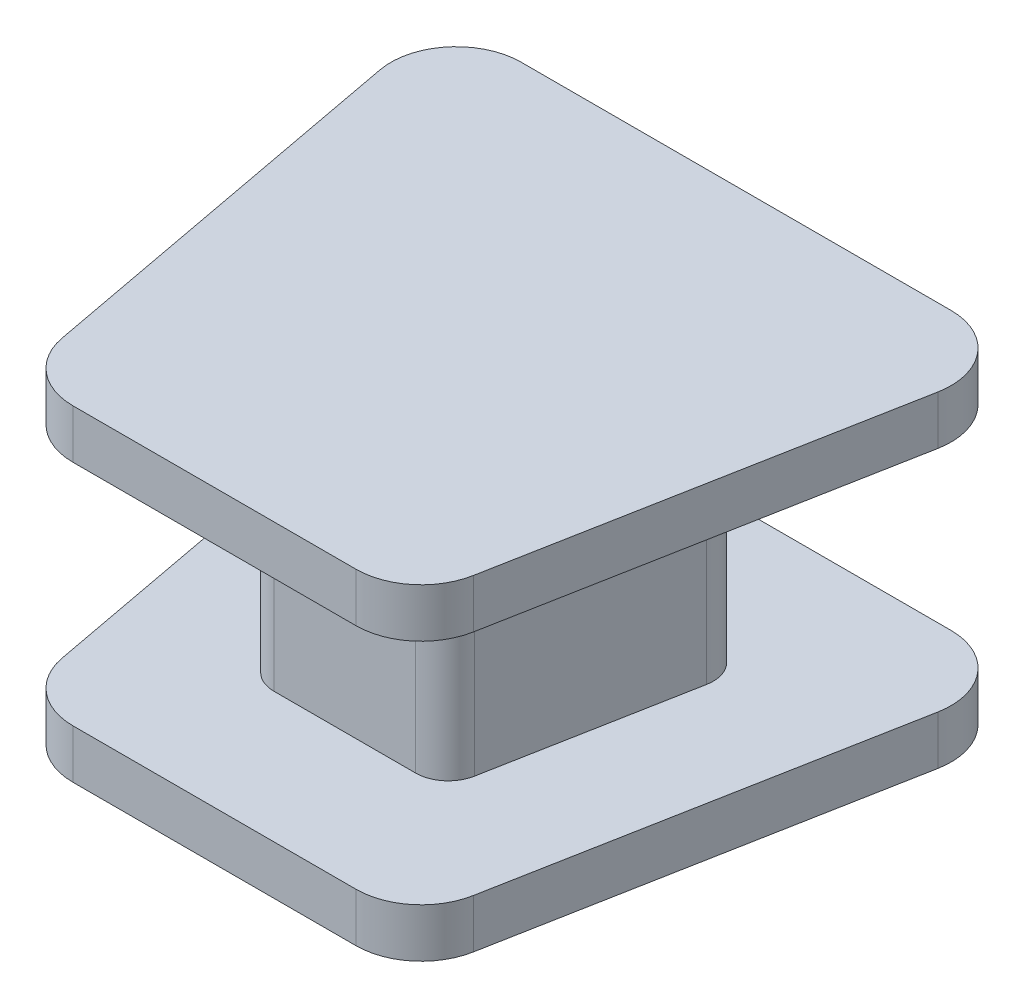
ISO-10303-21;
HEADER;
FILE_DESCRIPTION(('STEP AP214'),'2;1');
FILE_NAME('part.step','',(''),(''),'','','');
FILE_SCHEMA(('AUTOMOTIVE_DESIGN { 1 0 10303 214 1 1 1 1 }'));
ENDSEC;
DATA;
#1=APPLICATION_CONTEXT('core data for automotive mechanical design processes');
#2=APPLICATION_PROTOCOL_DEFINITION('international standard','automotive_design',2000,#1);
#3=PRODUCT_CONTEXT('',#1,'mechanical');
#4=PRODUCT('Part','Part','',(#3));
#5=PRODUCT_RELATED_PRODUCT_CATEGORY('part','',(#4));
#6=PRODUCT_DEFINITION_FORMATION('','',#4);
#7=PRODUCT_DEFINITION_CONTEXT('part definition',#1,'design');
#8=PRODUCT_DEFINITION('design','',#6,#7);
#9=PRODUCT_DEFINITION_SHAPE('','',#8);
#10=(LENGTH_UNIT() NAMED_UNIT(*) SI_UNIT(.MILLI.,.METRE.));
#11=(NAMED_UNIT(*) PLANE_ANGLE_UNIT() SI_UNIT($,.RADIAN.));
#12=(NAMED_UNIT(*) SI_UNIT($,.STERADIAN.) SOLID_ANGLE_UNIT());
#13=UNCERTAINTY_MEASURE_WITH_UNIT(LENGTH_MEASURE(1.E-05),#10,'distance_accuracy_value','');
#14=(GEOMETRIC_REPRESENTATION_CONTEXT(3) GLOBAL_UNCERTAINTY_ASSIGNED_CONTEXT((#13)) GLOBAL_UNIT_ASSIGNED_CONTEXT((#10,
#11,#12)) REPRESENTATION_CONTEXT('',''));
#15=CARTESIAN_POINT('',(0.,0.,0.));
#16=DIRECTION('',(0.,0.,1.));
#17=DIRECTION('',(1.,0.,0.));
#18=AXIS2_PLACEMENT_3D('',#15,#16,#17);
#19=CARTESIAN_POINT('',(11.0239744607383,12.7,15.24));
#20=DIRECTION('',(0.,-1.,0.));
#21=DIRECTION('',(0.,0.,-1.));
#22=AXIS2_PLACEMENT_3D('',#19,#20,#21);
#23=CYLINDRICAL_SURFACE('',#22,5.07999999999999);
#24=DIRECTION('',(0.,-1.,0.));
#25=VECTOR('',#24,1.);
#26=CARTESIAN_POINT('',(16.0169651703647,12.7,16.1761857580549));
#27=LINE('',#26,#25);
#28=CARTESIAN_POINT('',(16.0169651703647,-8.89,16.1761857580549));
#29=VERTEX_POINT('',#28);
#30=CARTESIAN_POINT('',(16.0169651703647,-12.7,16.1761857580549));
#31=VERTEX_POINT('',#30);
#32=EDGE_CURVE('E52',#29,#31,#27,.T.);
#33=ORIENTED_EDGE('',*,*,#32,.F.);
#34=CARTESIAN_POINT('',(11.0239744607383,-8.89,15.24));
#35=DIRECTION('',(0.,1.,0.));
#36=DIRECTION('',(0.,0.,-1.));
#37=AXIS2_PLACEMENT_3D('',#34,#35,#36);
#38=CIRCLE('',#37,5.07999999999999);
#39=CARTESIAN_POINT('',(11.0239744607383,-8.89,20.32));
#40=VERTEX_POINT('',#39);
#41=EDGE_CURVE('E304',#40,#29,#38,.T.);
#42=ORIENTED_EDGE('',*,*,#41,.F.);
#43=DIRECTION('',(0.,-1.,0.));
#44=VECTOR('',#43,1.);
#45=CARTESIAN_POINT('',(11.0239744607383,12.7,20.32));
#46=LINE('',#45,#44);
#47=CARTESIAN_POINT('',(11.0239744607383,-12.7,20.32));
#48=VERTEX_POINT('',#47);
#49=EDGE_CURVE('E383',#40,#48,#46,.T.);
#50=ORIENTED_EDGE('',*,*,#49,.T.);
#51=CARTESIAN_POINT('',(11.0239744607383,-12.7,15.24));
#52=DIRECTION('',(0.,1.,0.));
#53=DIRECTION('',(0.,0.,-1.));
#54=AXIS2_PLACEMENT_3D('',#51,#52,#53);
#55=CIRCLE('',#54,5.07999999999999);
#56=EDGE_CURVE('E328',#48,#31,#55,.T.);
#57=ORIENTED_EDGE('',*,*,#56,.T.);
#58=EDGE_LOOP('',(#33,#42,#50,#57));
#59=FACE_BOUND('',#58,.T.);
#60=ADVANCED_FACE('F44',(#59),#23,.T.);
#61=CARTESIAN_POINT('',(16.0169651703647,12.7,16.1761857580549));
#62=DIRECTION('',(-0.982872186934322,0.,-0.184288535050185));
#63=DIRECTION('',(-0.184288535050185,0.,0.982872186934322));
#64=AXIS2_PLACEMENT_3D('',#61,#62,#63);
#65=PLANE('',#64);
#66=DIRECTION('',(0.,-1.,0.));
#67=VECTOR('',#66,1.);
#68=CARTESIAN_POINT('',(21.7319651703647,12.7,-14.3038142419451));
#69=LINE('',#68,#67);
#70=CARTESIAN_POINT('',(21.7319651703647,-8.89,-14.3038142419451));
#71=VERTEX_POINT('',#70);
#72=CARTESIAN_POINT('',(21.7319651703647,-12.7,-14.3038142419451));
#73=VERTEX_POINT('',#72);
#74=EDGE_CURVE('E442',#71,#73,#69,.T.);
#75=ORIENTED_EDGE('',*,*,#74,.F.);
#76=DIRECTION('',(0.184288535050185,0.,-0.982872186934322));
#77=VECTOR('',#76,1.);
#78=CARTESIAN_POINT('',(16.0169651703647,-8.89,16.1761857580549));
#79=LINE('',#78,#77);
#80=EDGE_CURVE('E307',#29,#71,#79,.T.);
#81=ORIENTED_EDGE('',*,*,#80,.F.);
#82=ORIENTED_EDGE('',*,*,#32,.T.);
#83=DIRECTION('',(0.184288535050185,0.,-0.982872186934322));
#84=VECTOR('',#83,1.);
#85=CARTESIAN_POINT('',(16.0169651703647,-12.7,16.1761857580549));
#86=LINE('',#85,#84);
#87=EDGE_CURVE('E387',#31,#73,#86,.T.);
#88=ORIENTED_EDGE('',*,*,#87,.T.);
#89=EDGE_LOOP('',(#75,#81,#82,#88));
#90=FACE_BOUND('',#89,.T.);
#91=ADVANCED_FACE('F461',(#90),#65,.F.);
#92=CARTESIAN_POINT('',(16.7389744607383,12.7,-15.24));
#93=DIRECTION('',(0.,-1.,0.));
#94=DIRECTION('',(0.,0.,-1.));
#95=AXIS2_PLACEMENT_3D('',#92,#93,#94);
#96=CYLINDRICAL_SURFACE('',#95,5.08);
#97=DIRECTION('',(0.,-1.,0.));
#98=VECTOR('',#97,1.);
#99=CARTESIAN_POINT('',(16.7389744607383,12.7,-20.32));
#100=LINE('',#99,#98);
#101=CARTESIAN_POINT('',(16.7389744607383,-8.89,-20.32));
#102=VERTEX_POINT('',#101);
#103=CARTESIAN_POINT('',(16.7389744607383,-12.7,-20.32));
#104=VERTEX_POINT('',#103);
#105=EDGE_CURVE('E438',#102,#104,#100,.T.);
#106=ORIENTED_EDGE('',*,*,#105,.F.);
#107=CARTESIAN_POINT('',(16.7389744607383,-8.89,-15.24));
#108=DIRECTION('',(0.,1.,0.));
#109=DIRECTION('',(0.,0.,-1.));
#110=AXIS2_PLACEMENT_3D('',#107,#108,#109);
#111=CIRCLE('',#110,5.08);
#112=EDGE_CURVE('E311',#71,#102,#111,.T.);
#113=ORIENTED_EDGE('',*,*,#112,.F.);
#114=ORIENTED_EDGE('',*,*,#74,.T.);
#115=CARTESIAN_POINT('',(16.7389744607383,-12.7,-15.24));
#116=DIRECTION('',(0.,1.,0.));
#117=DIRECTION('',(0.,0.,-1.));
#118=AXIS2_PLACEMENT_3D('',#115,#116,#117);
#119=CIRCLE('',#118,5.08);
#120=EDGE_CURVE('E391',#73,#104,#119,.T.);
#121=ORIENTED_EDGE('',*,*,#120,.T.);
#122=EDGE_LOOP('',(#106,#113,#114,#121));
#123=FACE_BOUND('',#122,.T.);
#124=ADVANCED_FACE('F455',(#123),#96,.T.);
#125=CARTESIAN_POINT('',(-16.7389744607383,12.7,-20.32));
#126=DIRECTION('',(0.,0.,1.));
#127=DIRECTION('',(1.,0.,0.));
#128=AXIS2_PLACEMENT_3D('',#125,#126,#127);
#129=PLANE('',#128);
#130=DIRECTION('',(0.,-1.,0.));
#131=VECTOR('',#130,1.);
#132=CARTESIAN_POINT('',(-16.7389744607383,12.7,-20.32));
#133=LINE('',#132,#131);
#134=CARTESIAN_POINT('',(-16.7389744607383,-8.89,-20.32));
#135=VERTEX_POINT('',#134);
#136=CARTESIAN_POINT('',(-16.7389744607383,-12.7,-20.32));
#137=VERTEX_POINT('',#136);
#138=EDGE_CURVE('E433',#135,#137,#133,.T.);
#139=ORIENTED_EDGE('',*,*,#138,.F.);
#140=DIRECTION('',(-1.,0.,0.));
#141=VECTOR('',#140,1.);
#142=CARTESIAN_POINT('',(-16.7389744607383,-8.89,-20.32));
#143=LINE('',#142,#141);
#144=EDGE_CURVE('E314',#102,#135,#143,.T.);
#145=ORIENTED_EDGE('',*,*,#144,.F.);
#146=ORIENTED_EDGE('',*,*,#105,.T.);
#147=DIRECTION('',(-1.,0.,0.));
#148=VECTOR('',#147,1.);
#149=CARTESIAN_POINT('',(-16.7389744607383,-12.7,-20.32));
#150=LINE('',#149,#148);
#151=EDGE_CURVE('E395',#104,#137,#150,.T.);
#152=ORIENTED_EDGE('',*,*,#151,.T.);
#153=EDGE_LOOP('',(#139,#145,#146,#152));
#154=FACE_BOUND('',#153,.T.);
#155=ADVANCED_FACE('F470',(#154),#129,.F.);
#156=CARTESIAN_POINT('',(-16.7389744607383,12.7,-15.24));
#157=DIRECTION('',(0.,-1.,0.));
#158=DIRECTION('',(0.,0.,-1.));
#159=AXIS2_PLACEMENT_3D('',#156,#157,#158);
#160=CYLINDRICAL_SURFACE('',#159,5.08);
#161=DIRECTION('',(0.,-1.,0.));
#162=VECTOR('',#161,1.);
#163=CARTESIAN_POINT('',(-21.7319651703647,12.7,-14.3038142419451));
#164=LINE('',#163,#162);
#165=CARTESIAN_POINT('',(-21.7319651703647,-8.89,-14.3038142419451));
#166=VERTEX_POINT('',#165);
#167=CARTESIAN_POINT('',(-21.7319651703647,-12.7,-14.3038142419451));
#168=VERTEX_POINT('',#167);
#169=EDGE_CURVE('E428',#166,#168,#164,.T.);
#170=ORIENTED_EDGE('',*,*,#169,.F.);
#171=CARTESIAN_POINT('',(-16.7389744607383,-8.89,-15.24));
#172=DIRECTION('',(0.,1.,0.));
#173=DIRECTION('',(0.,0.,1.));
#174=AXIS2_PLACEMENT_3D('',#171,#172,#173);
#175=CIRCLE('',#174,5.08);
#176=EDGE_CURVE('E317',#135,#166,#175,.T.);
#177=ORIENTED_EDGE('',*,*,#176,.F.);
#178=ORIENTED_EDGE('',*,*,#138,.T.);
#179=CARTESIAN_POINT('',(-16.7389744607383,-12.7,-15.24));
#180=DIRECTION('',(0.,1.,0.));
#181=DIRECTION('',(0.,0.,1.));
#182=AXIS2_PLACEMENT_3D('',#179,#180,#181);
#183=CIRCLE('',#182,5.08);
#184=EDGE_CURVE('E399',#137,#168,#183,.T.);
#185=ORIENTED_EDGE('',*,*,#184,.T.);
#186=EDGE_LOOP('',(#170,#177,#178,#185));
#187=FACE_BOUND('',#186,.T.);
#188=ADVANCED_FACE('F495',(#187),#160,.T.);
#189=CARTESIAN_POINT('',(-16.0169651703647,12.7,16.1761857580549));
#190=DIRECTION('',(0.982872186934322,0.,-0.184288535050185));
#191=DIRECTION('',(-0.184288535050185,0.,-0.982872186934322));
#192=AXIS2_PLACEMENT_3D('',#189,#190,#191);
#193=PLANE('',#192);
#194=DIRECTION('',(0.,-1.,0.));
#195=VECTOR('',#194,1.);
#196=CARTESIAN_POINT('',(-16.0169651703647,12.7,16.1761857580549));
#197=LINE('',#196,#195);
#198=CARTESIAN_POINT('',(-16.0169651703647,-8.89,16.1761857580549));
#199=VERTEX_POINT('',#198);
#200=CARTESIAN_POINT('',(-16.0169651703647,-12.7,16.1761857580549));
#201=VERTEX_POINT('',#200);
#202=EDGE_CURVE('E423',#199,#201,#197,.T.);
#203=ORIENTED_EDGE('',*,*,#202,.F.);
#204=DIRECTION('',(0.184288535050185,0.,0.982872186934322));
#205=VECTOR('',#204,1.);
#206=CARTESIAN_POINT('',(-16.0169651703647,-8.89,16.1761857580549));
#207=LINE('',#206,#205);
#208=EDGE_CURVE('E320',#166,#199,#207,.T.);
#209=ORIENTED_EDGE('',*,*,#208,.F.);
#210=ORIENTED_EDGE('',*,*,#169,.T.);
#211=DIRECTION('',(0.184288535050185,0.,0.982872186934322));
#212=VECTOR('',#211,1.);
#213=CARTESIAN_POINT('',(-16.0169651703647,-12.7,16.1761857580549));
#214=LINE('',#213,#212);
#215=EDGE_CURVE('E403',#168,#201,#214,.T.);
#216=ORIENTED_EDGE('',*,*,#215,.T.);
#217=EDGE_LOOP('',(#203,#209,#210,#216));
#218=FACE_BOUND('',#217,.T.);
#219=ADVANCED_FACE('F491',(#218),#193,.F.);
#220=CARTESIAN_POINT('',(-11.0239744607383,12.7,15.24));
#221=DIRECTION('',(0.,-1.,0.));
#222=DIRECTION('',(0.,0.,-1.));
#223=AXIS2_PLACEMENT_3D('',#220,#221,#222);
#224=CYLINDRICAL_SURFACE('',#223,5.08);
#225=DIRECTION('',(0.,-1.,0.));
#226=VECTOR('',#225,1.);
#227=CARTESIAN_POINT('',(-11.0239744607383,12.7,20.32));
#228=LINE('',#227,#226);
#229=CARTESIAN_POINT('',(-11.0239744607383,-8.89,20.32));
#230=VERTEX_POINT('',#229);
#231=CARTESIAN_POINT('',(-11.0239744607383,-12.7,20.32));
#232=VERTEX_POINT('',#231);
#233=EDGE_CURVE('E418',#230,#232,#228,.T.);
#234=ORIENTED_EDGE('',*,*,#233,.F.);
#235=CARTESIAN_POINT('',(-11.0239744607383,-8.89,15.24));
#236=DIRECTION('',(0.,1.,0.));
#237=DIRECTION('',(0.,0.,1.));
#238=AXIS2_PLACEMENT_3D('',#235,#236,#237);
#239=CIRCLE('',#238,5.08);
#240=EDGE_CURVE('E59',#199,#230,#239,.T.);
#241=ORIENTED_EDGE('',*,*,#240,.F.);
#242=ORIENTED_EDGE('',*,*,#202,.T.);
#243=CARTESIAN_POINT('',(-11.0239744607383,-12.7,15.24));
#244=DIRECTION('',(0.,1.,0.));
#245=DIRECTION('',(0.,0.,1.));
#246=AXIS2_PLACEMENT_3D('',#243,#244,#245);
#247=CIRCLE('',#246,5.08);
#248=EDGE_CURVE('E407',#201,#232,#247,.T.);
#249=ORIENTED_EDGE('',*,*,#248,.T.);
#250=EDGE_LOOP('',(#234,#241,#242,#249));
#251=FACE_BOUND('',#250,.T.);
#252=ADVANCED_FACE('F487',(#251),#224,.T.);
#253=CARTESIAN_POINT('',(-11.0239744607383,12.7,20.32));
#254=DIRECTION('',(0.,0.,-1.));
#255=DIRECTION('',(-1.,0.,0.));
#256=AXIS2_PLACEMENT_3D('',#253,#254,#255);
#257=PLANE('',#256);
#258=ORIENTED_EDGE('',*,*,#49,.F.);
#259=DIRECTION('',(1.,0.,0.));
#260=VECTOR('',#259,1.);
#261=CARTESIAN_POINT('',(-11.0239744607383,-8.89,20.32));
#262=LINE('',#261,#260);
#263=EDGE_CURVE('E325',#230,#40,#262,.T.);
#264=ORIENTED_EDGE('',*,*,#263,.F.);
#265=ORIENTED_EDGE('',*,*,#233,.T.);
#266=DIRECTION('',(1.,0.,0.));
#267=VECTOR('',#266,1.);
#268=CARTESIAN_POINT('',(-11.0239744607383,-12.7,20.32));
#269=LINE('',#268,#267);
#270=EDGE_CURVE('E362',#232,#48,#269,.T.);
#271=ORIENTED_EDGE('',*,*,#270,.T.);
#272=EDGE_LOOP('',(#258,#264,#265,#271));
#273=FACE_BOUND('',#272,.T.);
#274=ADVANCED_FACE('F483',(#273),#257,.F.);
#275=CARTESIAN_POINT('',(11.0239744607383,-12.7,15.24));
#276=DIRECTION('',(0.,-1.,0.));
#277=DIRECTION('',(0.,0.,-1.));
#278=AXIS2_PLACEMENT_3D('',#275,#276,#277);
#279=PLANE('',#278);
#280=ORIENTED_EDGE('',*,*,#56,.F.);
#281=ORIENTED_EDGE('',*,*,#270,.F.);
#282=ORIENTED_EDGE('',*,*,#248,.F.);
#283=ORIENTED_EDGE('',*,*,#215,.F.);
#284=ORIENTED_EDGE('',*,*,#184,.F.);
#285=ORIENTED_EDGE('',*,*,#151,.F.);
#286=ORIENTED_EDGE('',*,*,#120,.F.);
#287=ORIENTED_EDGE('',*,*,#87,.F.);
#288=EDGE_LOOP('',(#280,#281,#282,#283,#284,#285,#286,#287));
#289=FACE_BOUND('',#288,.T.);
#290=ADVANCED_FACE('F465',(#289),#279,.T.);
#291=CARTESIAN_POINT('',(11.0239744607383,-8.89,15.24));
#292=DIRECTION('',(0.,-1.,0.));
#293=DIRECTION('',(0.,0.,-1.));
#294=AXIS2_PLACEMENT_3D('',#291,#292,#293);
#295=PLANE('',#294);
#296=CARTESIAN_POINT('',(-8.36948723036917,-8.89,-7.62));
#297=DIRECTION('',(0.,1.,0.));
#298=DIRECTION('',(0.,0.,1.));
#299=AXIS2_PLACEMENT_3D('',#296,#297,#298);
#300=CIRCLE('',#299,2.54);
#301=CARTESIAN_POINT('',(-8.36948723036917,-8.89,-10.16));
#302=VERTEX_POINT('',#301);
#303=CARTESIAN_POINT('',(-10.8659825851823,-8.89,-7.15190712097253));
#304=VERTEX_POINT('',#303);
#305=EDGE_CURVE('E223',#302,#304,#300,.T.);
#306=ORIENTED_EDGE('',*,*,#305,.F.);
#307=DIRECTION('',(-1.,0.,0.));
#308=VECTOR('',#307,1.);
#309=CARTESIAN_POINT('',(8.36948723036917,-8.89,-10.16));
#310=LINE('',#309,#308);
#311=CARTESIAN_POINT('',(8.36948723036917,-8.89,-10.16));
#312=VERTEX_POINT('',#311);
#313=EDGE_CURVE('E217',#312,#302,#310,.T.);
#314=ORIENTED_EDGE('',*,*,#313,.F.);
#315=CARTESIAN_POINT('',(8.36948723036917,-8.89,-7.62));
#316=DIRECTION('',(0.,1.,0.));
#317=DIRECTION('',(0.,0.,-1.));
#318=AXIS2_PLACEMENT_3D('',#315,#316,#317);
#319=CIRCLE('',#318,2.54);
#320=CARTESIAN_POINT('',(10.8659825851823,-8.89,-7.15190712097253));
#321=VERTEX_POINT('',#320);
#322=EDGE_CURVE('E255',#321,#312,#319,.T.);
#323=ORIENTED_EDGE('',*,*,#322,.F.);
#324=DIRECTION('',(0.184288535050185,0.,-0.982872186934322));
#325=VECTOR('',#324,1.);
#326=CARTESIAN_POINT('',(10.8659825851823,-8.89,-7.15190712097253));
#327=LINE('',#326,#325);
#328=CARTESIAN_POINT('',(8.00848258518235,-8.89,8.08809287902747));
#329=VERTEX_POINT('',#328);
#330=EDGE_CURVE('E251',#329,#321,#327,.T.);
#331=ORIENTED_EDGE('',*,*,#330,.F.);
#332=CARTESIAN_POINT('',(5.51198723036917,-8.89,7.62));
#333=DIRECTION('',(0.,1.,0.));
#334=DIRECTION('',(0.,0.,-1.));
#335=AXIS2_PLACEMENT_3D('',#332,#333,#334);
#336=CIRCLE('',#335,2.54);
#337=CARTESIAN_POINT('',(5.51198723036917,-8.89,10.16));
#338=VERTEX_POINT('',#337);
#339=EDGE_CURVE('E247',#338,#329,#336,.T.);
#340=ORIENTED_EDGE('',*,*,#339,.F.);
#341=DIRECTION('',(1.,0.,0.));
#342=VECTOR('',#341,1.);
#343=CARTESIAN_POINT('',(5.51198723036917,-8.89,10.16));
#344=LINE('',#343,#342);
#345=CARTESIAN_POINT('',(-5.51198723036917,-8.89,10.16));
#346=VERTEX_POINT('',#345);
#347=EDGE_CURVE('E243',#346,#338,#344,.T.);
#348=ORIENTED_EDGE('',*,*,#347,.F.);
#349=CARTESIAN_POINT('',(-5.51198723036917,-8.89,7.62));
#350=DIRECTION('',(0.,1.,0.));
#351=DIRECTION('',(0.,0.,1.));
#352=AXIS2_PLACEMENT_3D('',#349,#350,#351);
#353=CIRCLE('',#352,2.54);
#354=CARTESIAN_POINT('',(-8.00848258518235,-8.89,8.08809287902747));
#355=VERTEX_POINT('',#354);
#356=EDGE_CURVE('E227',#355,#346,#353,.T.);
#357=ORIENTED_EDGE('',*,*,#356,.F.);
#358=DIRECTION('',(0.184288535050185,0.,0.982872186934322));
#359=VECTOR('',#358,1.);
#360=CARTESIAN_POINT('',(-10.8659825851823,-8.89,-7.15190712097253));
#361=LINE('',#360,#359);
#362=EDGE_CURVE('E209',#304,#355,#361,.T.);
#363=ORIENTED_EDGE('',*,*,#362,.F.);
#364=EDGE_LOOP('',(#306,#314,#323,#331,#340,#348,#357,#363));
#365=FACE_BOUND('',#364,.T.);
#366=ORIENTED_EDGE('',*,*,#41,.T.);
#367=ORIENTED_EDGE('',*,*,#80,.T.);
#368=ORIENTED_EDGE('',*,*,#112,.T.);
#369=ORIENTED_EDGE('',*,*,#144,.T.);
#370=ORIENTED_EDGE('',*,*,#176,.T.);
#371=ORIENTED_EDGE('',*,*,#208,.T.);
#372=ORIENTED_EDGE('',*,*,#240,.T.);
#373=ORIENTED_EDGE('',*,*,#263,.T.);
#374=EDGE_LOOP('',(#366,#367,#368,#369,#370,#371,#372,#373));
#375=FACE_BOUND('',#374,.T.);
#376=ADVANCED_FACE('F221',(#365,#375),#295,.F.);
#377=CARTESIAN_POINT('',(11.0239744607383,8.89,15.24));
#378=DIRECTION('',(0.,-1.,0.));
#379=DIRECTION('',(0.,0.,-1.));
#380=AXIS2_PLACEMENT_3D('',#377,#378,#379);
#381=PLANE('',#380);
#382=DIRECTION('',(0.184288535050185,0.,0.982872186934322));
#383=VECTOR('',#382,1.);
#384=CARTESIAN_POINT('',(-10.8659825851823,8.89,-7.15190712097253));
#385=LINE('',#384,#383);
#386=CARTESIAN_POINT('',(-10.8659825851823,8.89,-7.15190712097253));
#387=VERTEX_POINT('',#386);
#388=CARTESIAN_POINT('',(-8.00848258518235,8.89,8.08809287902747));
#389=VERTEX_POINT('',#388);
#390=EDGE_CURVE('E211',#387,#389,#385,.T.);
#391=ORIENTED_EDGE('',*,*,#390,.T.);
#392=CARTESIAN_POINT('',(-5.51198723036917,8.89,7.62));
#393=DIRECTION('',(0.,1.,0.));
#394=DIRECTION('',(0.,0.,1.));
#395=AXIS2_PLACEMENT_3D('',#392,#393,#394);
#396=CIRCLE('',#395,2.54);
#397=CARTESIAN_POINT('',(-5.51198723036917,8.89,10.16));
#398=VERTEX_POINT('',#397);
#399=EDGE_CURVE('E266',#389,#398,#396,.T.);
#400=ORIENTED_EDGE('',*,*,#399,.T.);
#401=DIRECTION('',(1.,0.,0.));
#402=VECTOR('',#401,1.);
#403=CARTESIAN_POINT('',(5.51198723036917,8.89,10.16));
#404=LINE('',#403,#402);
#405=CARTESIAN_POINT('',(5.51198723036917,8.89,10.16));
#406=VERTEX_POINT('',#405);
#407=EDGE_CURVE('E270',#398,#406,#404,.T.);
#408=ORIENTED_EDGE('',*,*,#407,.T.);
#409=CARTESIAN_POINT('',(5.51198723036917,8.89,7.62));
#410=DIRECTION('',(0.,1.,0.));
#411=DIRECTION('',(0.,0.,-1.));
#412=AXIS2_PLACEMENT_3D('',#409,#410,#411);
#413=CIRCLE('',#412,2.54);
#414=CARTESIAN_POINT('',(8.00848258518235,8.89,8.08809287902747));
#415=VERTEX_POINT('',#414);
#416=EDGE_CURVE('E274',#406,#415,#413,.T.);
#417=ORIENTED_EDGE('',*,*,#416,.T.);
#418=DIRECTION('',(0.184288535050185,0.,-0.982872186934322));
#419=VECTOR('',#418,1.);
#420=CARTESIAN_POINT('',(10.8659825851823,8.89,-7.15190712097253));
#421=LINE('',#420,#419);
#422=CARTESIAN_POINT('',(10.8659825851823,8.89,-7.15190712097253));
#423=VERTEX_POINT('',#422);
#424=EDGE_CURVE('E278',#415,#423,#421,.T.);
#425=ORIENTED_EDGE('',*,*,#424,.T.);
#426=CARTESIAN_POINT('',(8.36948723036917,8.89,-7.62));
#427=DIRECTION('',(0.,1.,0.));
#428=DIRECTION('',(0.,0.,-1.));
#429=AXIS2_PLACEMENT_3D('',#426,#427,#428);
#430=CIRCLE('',#429,2.54);
#431=CARTESIAN_POINT('',(8.36948723036917,8.89,-10.16));
#432=VERTEX_POINT('',#431);
#433=EDGE_CURVE('E238',#423,#432,#430,.T.);
#434=ORIENTED_EDGE('',*,*,#433,.T.);
#435=DIRECTION('',(-1.,0.,0.));
#436=VECTOR('',#435,1.);
#437=CARTESIAN_POINT('',(8.36948723036917,8.89,-10.16));
#438=LINE('',#437,#436);
#439=CARTESIAN_POINT('',(-8.36948723036917,8.89,-10.16));
#440=VERTEX_POINT('',#439);
#441=EDGE_CURVE('E234',#432,#440,#438,.T.);
#442=ORIENTED_EDGE('',*,*,#441,.T.);
#443=CARTESIAN_POINT('',(-8.36948723036917,8.89,-7.62));
#444=DIRECTION('',(0.,1.,0.));
#445=DIRECTION('',(0.,0.,1.));
#446=AXIS2_PLACEMENT_3D('',#443,#444,#445);
#447=CIRCLE('',#446,2.54);
#448=EDGE_CURVE('E261',#440,#387,#447,.T.);
#449=ORIENTED_EDGE('',*,*,#448,.T.);
#450=EDGE_LOOP('',(#391,#400,#408,#417,#425,#434,#442,#449));
#451=FACE_BOUND('',#450,.T.);
#452=CARTESIAN_POINT('',(11.0239744607383,8.89,15.24));
#453=DIRECTION('',(0.,1.,0.));
#454=DIRECTION('',(0.,0.,-1.));
#455=AXIS2_PLACEMENT_3D('',#452,#453,#454);
#456=CIRCLE('',#455,5.07999999999999);
#457=CARTESIAN_POINT('',(11.0239744607383,8.89,20.32));
#458=VERTEX_POINT('',#457);
#459=CARTESIAN_POINT('',(16.0169651703647,8.89,16.1761857580549));
#460=VERTEX_POINT('',#459);
#461=EDGE_CURVE('E67',#458,#460,#456,.T.);
#462=ORIENTED_EDGE('',*,*,#461,.F.);
#463=DIRECTION('',(1.,0.,0.));
#464=VECTOR('',#463,1.);
#465=CARTESIAN_POINT('',(-11.0239744607383,8.89,20.32));
#466=LINE('',#465,#464);
#467=CARTESIAN_POINT('',(-11.0239744607383,8.89,20.32));
#468=VERTEX_POINT('',#467);
#469=EDGE_CURVE('E308',#468,#458,#466,.T.);
#470=ORIENTED_EDGE('',*,*,#469,.F.);
#471=CARTESIAN_POINT('',(-11.0239744607383,8.89,15.24));
#472=DIRECTION('',(0.,1.,0.));
#473=DIRECTION('',(0.,0.,1.));
#474=AXIS2_PLACEMENT_3D('',#471,#472,#473);
#475=CIRCLE('',#474,5.08);
#476=CARTESIAN_POINT('',(-16.0169651703647,8.89,16.1761857580549));
#477=VERTEX_POINT('',#476);
#478=EDGE_CURVE('E351',#477,#468,#475,.T.);
#479=ORIENTED_EDGE('',*,*,#478,.F.);
#480=DIRECTION('',(0.184288535050185,0.,0.982872186934322));
#481=VECTOR('',#480,1.);
#482=CARTESIAN_POINT('',(-16.0169651703647,8.89,16.1761857580549));
#483=LINE('',#482,#481);
#484=CARTESIAN_POINT('',(-21.7319651703647,8.89,-14.3038142419451));
#485=VERTEX_POINT('',#484);
#486=EDGE_CURVE('E347',#485,#477,#483,.T.);
#487=ORIENTED_EDGE('',*,*,#486,.F.);
#488=CARTESIAN_POINT('',(-16.7389744607383,8.89,-15.24));
#489=DIRECTION('',(0.,1.,0.));
#490=DIRECTION('',(0.,0.,1.));
#491=AXIS2_PLACEMENT_3D('',#488,#489,#490);
#492=CIRCLE('',#491,5.08);
#493=CARTESIAN_POINT('',(-16.7389744607383,8.89,-20.32));
#494=VERTEX_POINT('',#493);
#495=EDGE_CURVE('E343',#494,#485,#492,.T.);
#496=ORIENTED_EDGE('',*,*,#495,.F.);
#497=DIRECTION('',(-1.,0.,0.));
#498=VECTOR('',#497,1.);
#499=CARTESIAN_POINT('',(-16.7389744607383,8.89,-20.32));
#500=LINE('',#499,#498);
#501=CARTESIAN_POINT('',(16.7389744607383,8.89,-20.32));
#502=VERTEX_POINT('',#501);
#503=EDGE_CURVE('E339',#502,#494,#500,.T.);
#504=ORIENTED_EDGE('',*,*,#503,.F.);
#505=CARTESIAN_POINT('',(16.7389744607383,8.89,-15.24));
#506=DIRECTION('',(0.,1.,0.));
#507=DIRECTION('',(0.,0.,-1.));
#508=AXIS2_PLACEMENT_3D('',#505,#506,#507);
#509=CIRCLE('',#508,5.08);
#510=CARTESIAN_POINT('',(21.7319651703647,8.89,-14.3038142419451));
#511=VERTEX_POINT('',#510);
#512=EDGE_CURVE('E335',#511,#502,#509,.T.);
#513=ORIENTED_EDGE('',*,*,#512,.F.);
#514=DIRECTION('',(0.184288535050185,0.,-0.982872186934322));
#515=VECTOR('',#514,1.);
#516=CARTESIAN_POINT('',(16.0169651703647,8.89,16.1761857580549));
#517=LINE('',#516,#515);
#518=EDGE_CURVE('E331',#460,#511,#517,.T.);
#519=ORIENTED_EDGE('',*,*,#518,.F.);
#520=EDGE_LOOP('',(#462,#470,#479,#487,#496,#504,#513,#519));
#521=FACE_BOUND('',#520,.T.);
#522=ADVANCED_FACE('F497',(#451,#521),#381,.T.);
#523=CARTESIAN_POINT('',(-8.36948723036917,-8.89,-7.62));
#524=DIRECTION('',(0.,1.,0.));
#525=DIRECTION('',(0.,0.,1.));
#526=AXIS2_PLACEMENT_3D('',#523,#524,#525);
#527=CYLINDRICAL_SURFACE('',#526,2.54);
#528=ORIENTED_EDGE('',*,*,#448,.F.);
#529=DIRECTION('',(0.,1.,0.));
#530=VECTOR('',#529,1.);
#531=CARTESIAN_POINT('',(-8.36948723036917,-8.89,-10.16));
#532=LINE('',#531,#530);
#533=EDGE_CURVE('E232',#302,#440,#532,.T.);
#534=ORIENTED_EDGE('',*,*,#533,.F.);
#535=ORIENTED_EDGE('',*,*,#305,.T.);
#536=DIRECTION('',(0.,1.,0.));
#537=VECTOR('',#536,1.);
#538=CARTESIAN_POINT('',(-10.8659825851823,-8.89,-7.15190712097253));
#539=LINE('',#538,#537);
#540=EDGE_CURVE('E206',#304,#387,#539,.T.);
#541=ORIENTED_EDGE('',*,*,#540,.T.);
#542=EDGE_LOOP('',(#528,#534,#535,#541));
#543=FACE_BOUND('',#542,.T.);
#544=ADVANCED_FACE('F231',(#543),#527,.T.);
#545=CARTESIAN_POINT('',(8.36948723036917,-8.89,-10.16));
#546=DIRECTION('',(0.,0.,-1.));
#547=DIRECTION('',(-1.,0.,0.));
#548=AXIS2_PLACEMENT_3D('',#545,#546,#547);
#549=PLANE('',#548);
#550=ORIENTED_EDGE('',*,*,#441,.F.);
#551=DIRECTION('',(0.,1.,0.));
#552=VECTOR('',#551,1.);
#553=CARTESIAN_POINT('',(8.36948723036917,-8.89,-10.16));
#554=LINE('',#553,#552);
#555=EDGE_CURVE('E287',#312,#432,#554,.T.);
#556=ORIENTED_EDGE('',*,*,#555,.F.);
#557=ORIENTED_EDGE('',*,*,#313,.T.);
#558=ORIENTED_EDGE('',*,*,#533,.T.);
#559=EDGE_LOOP('',(#550,#556,#557,#558));
#560=FACE_BOUND('',#559,.T.);
#561=ADVANCED_FACE('F581',(#560),#549,.T.);
#562=CARTESIAN_POINT('',(8.36948723036917,-8.89,-7.62));
#563=DIRECTION('',(0.,1.,0.));
#564=DIRECTION('',(0.,0.,1.));
#565=AXIS2_PLACEMENT_3D('',#562,#563,#564);
#566=CYLINDRICAL_SURFACE('',#565,2.54);
#567=ORIENTED_EDGE('',*,*,#433,.F.);
#568=DIRECTION('',(0.,1.,0.));
#569=VECTOR('',#568,1.);
#570=CARTESIAN_POINT('',(10.8659825851823,-8.89,-7.15190712097253));
#571=LINE('',#570,#569);
#572=EDGE_CURVE('E290',#321,#423,#571,.T.);
#573=ORIENTED_EDGE('',*,*,#572,.F.);
#574=ORIENTED_EDGE('',*,*,#322,.T.);
#575=ORIENTED_EDGE('',*,*,#555,.T.);
#576=EDGE_LOOP('',(#567,#573,#574,#575));
#577=FACE_BOUND('',#576,.T.);
#578=ADVANCED_FACE('F585',(#577),#566,.T.);
#579=CARTESIAN_POINT('',(10.8659825851823,-8.89,-7.15190712097253));
#580=DIRECTION('',(0.982872186934322,0.,0.184288535050185));
#581=DIRECTION('',(0.184288535050185,0.,-0.982872186934322));
#582=AXIS2_PLACEMENT_3D('',#579,#580,#581);
#583=PLANE('',#582);
#584=ORIENTED_EDGE('',*,*,#424,.F.);
#585=DIRECTION('',(0.,1.,0.));
#586=VECTOR('',#585,1.);
#587=CARTESIAN_POINT('',(8.00848258518235,-8.89,8.08809287902747));
#588=LINE('',#587,#586);
#589=EDGE_CURVE('E293',#329,#415,#588,.T.);
#590=ORIENTED_EDGE('',*,*,#589,.F.);
#591=ORIENTED_EDGE('',*,*,#330,.T.);
#592=ORIENTED_EDGE('',*,*,#572,.T.);
#593=EDGE_LOOP('',(#584,#590,#591,#592));
#594=FACE_BOUND('',#593,.T.);
#595=ADVANCED_FACE('F591',(#594),#583,.T.);
#596=CARTESIAN_POINT('',(5.51198723036917,-8.89,7.62));
#597=DIRECTION('',(0.,1.,0.));
#598=DIRECTION('',(0.,0.,1.));
#599=AXIS2_PLACEMENT_3D('',#596,#597,#598);
#600=CYLINDRICAL_SURFACE('',#599,2.54);
#601=ORIENTED_EDGE('',*,*,#416,.F.);
#602=DIRECTION('',(0.,1.,0.));
#603=VECTOR('',#602,1.);
#604=CARTESIAN_POINT('',(5.51198723036917,-8.89,10.16));
#605=LINE('',#604,#603);
#606=EDGE_CURVE('E296',#338,#406,#605,.T.);
#607=ORIENTED_EDGE('',*,*,#606,.F.);
#608=ORIENTED_EDGE('',*,*,#339,.T.);
#609=ORIENTED_EDGE('',*,*,#589,.T.);
#610=EDGE_LOOP('',(#601,#607,#608,#609));
#611=FACE_BOUND('',#610,.T.);
#612=ADVANCED_FACE('F598',(#611),#600,.T.);
#613=CARTESIAN_POINT('',(5.51198723036917,-8.89,10.16));
#614=DIRECTION('',(0.,0.,1.));
#615=DIRECTION('',(1.,0.,0.));
#616=AXIS2_PLACEMENT_3D('',#613,#614,#615);
#617=PLANE('',#616);
#618=ORIENTED_EDGE('',*,*,#407,.F.);
#619=DIRECTION('',(0.,1.,0.));
#620=VECTOR('',#619,1.);
#621=CARTESIAN_POINT('',(-5.51198723036917,-8.89,10.16));
#622=LINE('',#621,#620);
#623=EDGE_CURVE('E299',#346,#398,#622,.T.);
#624=ORIENTED_EDGE('',*,*,#623,.F.);
#625=ORIENTED_EDGE('',*,*,#347,.T.);
#626=ORIENTED_EDGE('',*,*,#606,.T.);
#627=EDGE_LOOP('',(#618,#624,#625,#626));
#628=FACE_BOUND('',#627,.T.);
#629=ADVANCED_FACE('F576',(#628),#617,.T.);
#630=CARTESIAN_POINT('',(-5.51198723036917,-8.89,7.62));
#631=DIRECTION('',(0.,1.,0.));
#632=DIRECTION('',(0.,0.,1.));
#633=AXIS2_PLACEMENT_3D('',#630,#631,#632);
#634=CYLINDRICAL_SURFACE('',#633,2.54);
#635=ORIENTED_EDGE('',*,*,#399,.F.);
#636=DIRECTION('',(0.,1.,0.));
#637=VECTOR('',#636,1.);
#638=CARTESIAN_POINT('',(-8.00848258518235,-8.89,8.08809287902747));
#639=LINE('',#638,#637);
#640=EDGE_CURVE('E216',#355,#389,#639,.T.);
#641=ORIENTED_EDGE('',*,*,#640,.F.);
#642=ORIENTED_EDGE('',*,*,#356,.T.);
#643=ORIENTED_EDGE('',*,*,#623,.T.);
#644=EDGE_LOOP('',(#635,#641,#642,#643));
#645=FACE_BOUND('',#644,.T.);
#646=ADVANCED_FACE('F571',(#645),#634,.T.);
#647=CARTESIAN_POINT('',(-10.8659825851823,-8.89,-7.15190712097253));
#648=DIRECTION('',(-0.982872186934322,0.,0.184288535050185));
#649=DIRECTION('',(0.184288535050185,0.,0.982872186934322));
#650=AXIS2_PLACEMENT_3D('',#647,#648,#649);
#651=PLANE('',#650);
#652=ORIENTED_EDGE('',*,*,#390,.F.);
#653=ORIENTED_EDGE('',*,*,#540,.F.);
#654=ORIENTED_EDGE('',*,*,#362,.T.);
#655=ORIENTED_EDGE('',*,*,#640,.T.);
#656=EDGE_LOOP('',(#652,#653,#654,#655));
#657=FACE_BOUND('',#656,.T.);
#658=ADVANCED_FACE('F208',(#657),#651,.T.);
#659=CARTESIAN_POINT('',(11.0239744607383,12.7,15.24));
#660=DIRECTION('',(0.,-1.,0.));
#661=DIRECTION('',(0.,0.,-1.));
#662=AXIS2_PLACEMENT_3D('',#659,#660,#661);
#663=PLANE('',#662);
#664=CARTESIAN_POINT('',(11.0239744607383,12.7,15.24));
#665=DIRECTION('',(0.,1.,0.));
#666=DIRECTION('',(0.,0.,-1.));
#667=AXIS2_PLACEMENT_3D('',#664,#665,#666);
#668=CIRCLE('',#667,5.07999999999999);
#669=CARTESIAN_POINT('',(11.0239744607383,12.7,20.32));
#670=VERTEX_POINT('',#669);
#671=CARTESIAN_POINT('',(16.0169651703647,12.7,16.1761857580549));
#672=VERTEX_POINT('',#671);
#673=EDGE_CURVE('E357',#670,#672,#668,.T.);
#674=ORIENTED_EDGE('',*,*,#673,.T.);
#675=DIRECTION('',(0.184288535050185,0.,-0.982872186934322));
#676=VECTOR('',#675,1.);
#677=CARTESIAN_POINT('',(16.0169651703647,12.7,16.1761857580549));
#678=LINE('',#677,#676);
#679=CARTESIAN_POINT('',(21.7319651703647,12.7,-14.3038142419451));
#680=VERTEX_POINT('',#679);
#681=EDGE_CURVE('E361',#672,#680,#678,.T.);
#682=ORIENTED_EDGE('',*,*,#681,.T.);
#683=CARTESIAN_POINT('',(16.7389744607383,12.7,-15.24));
#684=DIRECTION('',(0.,1.,0.));
#685=DIRECTION('',(0.,0.,-1.));
#686=AXIS2_PLACEMENT_3D('',#683,#684,#685);
#687=CIRCLE('',#686,5.08);
#688=CARTESIAN_POINT('',(16.7389744607383,12.7,-20.32));
#689=VERTEX_POINT('',#688);
#690=EDGE_CURVE('E365',#680,#689,#687,.T.);
#691=ORIENTED_EDGE('',*,*,#690,.T.);
#692=DIRECTION('',(-1.,0.,0.));
#693=VECTOR('',#692,1.);
#694=CARTESIAN_POINT('',(-16.7389744607383,12.7,-20.32));
#695=LINE('',#694,#693);
#696=CARTESIAN_POINT('',(-16.7389744607383,12.7,-20.32));
#697=VERTEX_POINT('',#696);
#698=EDGE_CURVE('E368',#689,#697,#695,.T.);
#699=ORIENTED_EDGE('',*,*,#698,.T.);
#700=CARTESIAN_POINT('',(-16.7389744607383,12.7,-15.24));
#701=DIRECTION('',(0.,1.,0.));
#702=DIRECTION('',(0.,0.,1.));
#703=AXIS2_PLACEMENT_3D('',#700,#701,#702);
#704=CIRCLE('',#703,5.08);
#705=CARTESIAN_POINT('',(-21.7319651703647,12.7,-14.3038142419451));
#706=VERTEX_POINT('',#705);
#707=EDGE_CURVE('E371',#697,#706,#704,.T.);
#708=ORIENTED_EDGE('',*,*,#707,.T.);
#709=DIRECTION('',(0.184288535050185,0.,0.982872186934322));
#710=VECTOR('',#709,1.);
#711=CARTESIAN_POINT('',(-16.0169651703647,12.7,16.1761857580549));
#712=LINE('',#711,#710);
#713=CARTESIAN_POINT('',(-16.0169651703647,12.7,16.1761857580549));
#714=VERTEX_POINT('',#713);
#715=EDGE_CURVE('E374',#706,#714,#712,.T.);
#716=ORIENTED_EDGE('',*,*,#715,.T.);
#717=CARTESIAN_POINT('',(-11.0239744607383,12.7,15.24));
#718=DIRECTION('',(0.,1.,0.));
#719=DIRECTION('',(0.,0.,1.));
#720=AXIS2_PLACEMENT_3D('',#717,#718,#719);
#721=CIRCLE('',#720,5.08);
#722=CARTESIAN_POINT('',(-11.0239744607383,12.7,20.32));
#723=VERTEX_POINT('',#722);
#724=EDGE_CURVE('E377',#714,#723,#721,.T.);
#725=ORIENTED_EDGE('',*,*,#724,.T.);
#726=DIRECTION('',(1.,0.,0.));
#727=VECTOR('',#726,1.);
#728=CARTESIAN_POINT('',(-11.0239744607383,12.7,20.32));
#729=LINE('',#728,#727);
#730=EDGE_CURVE('E380',#723,#670,#729,.T.);
#731=ORIENTED_EDGE('',*,*,#730,.T.);
#732=EDGE_LOOP('',(#674,#682,#691,#699,#708,#716,#725,#731));
#733=FACE_BOUND('',#732,.T.);
#734=ADVANCED_FACE('F525',(#733),#663,.F.);
#735=ORIENTED_EDGE('',*,*,#469,.T.);
#736=EDGE_CURVE('E414',#670,#458,#46,.T.);
#737=ORIENTED_EDGE('',*,*,#736,.F.);
#738=ORIENTED_EDGE('',*,*,#730,.F.);
#739=EDGE_CURVE('E419',#723,#468,#228,.T.);
#740=ORIENTED_EDGE('',*,*,#739,.T.);
#741=EDGE_LOOP('',(#735,#737,#738,#740));
#742=FACE_BOUND('',#741,.T.);
#743=ADVANCED_FACE('F530',(#742),#257,.F.);
#744=ORIENTED_EDGE('',*,*,#478,.T.);
#745=ORIENTED_EDGE('',*,*,#739,.F.);
#746=ORIENTED_EDGE('',*,*,#724,.F.);
#747=EDGE_CURVE('E424',#714,#477,#197,.T.);
#748=ORIENTED_EDGE('',*,*,#747,.T.);
#749=EDGE_LOOP('',(#744,#745,#746,#748));
#750=FACE_BOUND('',#749,.T.);
#751=ADVANCED_FACE('F532',(#750),#224,.T.);
#752=ORIENTED_EDGE('',*,*,#486,.T.);
#753=ORIENTED_EDGE('',*,*,#747,.F.);
#754=ORIENTED_EDGE('',*,*,#715,.F.);
#755=EDGE_CURVE('E429',#706,#485,#164,.T.);
#756=ORIENTED_EDGE('',*,*,#755,.T.);
#757=EDGE_LOOP('',(#752,#753,#754,#756));
#758=FACE_BOUND('',#757,.T.);
#759=ADVANCED_FACE('F536',(#758),#193,.F.);
#760=ORIENTED_EDGE('',*,*,#495,.T.);
#761=ORIENTED_EDGE('',*,*,#755,.F.);
#762=ORIENTED_EDGE('',*,*,#707,.F.);
#763=EDGE_CURVE('E434',#697,#494,#133,.T.);
#764=ORIENTED_EDGE('',*,*,#763,.T.);
#765=EDGE_LOOP('',(#760,#761,#762,#764));
#766=FACE_BOUND('',#765,.T.);
#767=ADVANCED_FACE('F539',(#766),#160,.T.);
#768=ORIENTED_EDGE('',*,*,#503,.T.);
#769=ORIENTED_EDGE('',*,*,#763,.F.);
#770=ORIENTED_EDGE('',*,*,#698,.F.);
#771=EDGE_CURVE('E439',#689,#502,#100,.T.);
#772=ORIENTED_EDGE('',*,*,#771,.T.);
#773=EDGE_LOOP('',(#768,#769,#770,#772));
#774=FACE_BOUND('',#773,.T.);
#775=ADVANCED_FACE('F544',(#774),#129,.F.);
#776=ORIENTED_EDGE('',*,*,#512,.T.);
#777=ORIENTED_EDGE('',*,*,#771,.F.);
#778=ORIENTED_EDGE('',*,*,#690,.F.);
#779=EDGE_CURVE('E443',#680,#511,#69,.T.);
#780=ORIENTED_EDGE('',*,*,#779,.T.);
#781=EDGE_LOOP('',(#776,#777,#778,#780));
#782=FACE_BOUND('',#781,.T.);
#783=ADVANCED_FACE('F519',(#782),#96,.T.);
#784=ORIENTED_EDGE('',*,*,#518,.T.);
#785=ORIENTED_EDGE('',*,*,#779,.F.);
#786=ORIENTED_EDGE('',*,*,#681,.F.);
#787=EDGE_CURVE('E11',#672,#460,#27,.T.);
#788=ORIENTED_EDGE('',*,*,#787,.T.);
#789=EDGE_LOOP('',(#784,#785,#786,#788));
#790=FACE_BOUND('',#789,.T.);
#791=ADVANCED_FACE('F513',(#790),#65,.F.);
#792=ORIENTED_EDGE('',*,*,#461,.T.);
#793=ORIENTED_EDGE('',*,*,#787,.F.);
#794=ORIENTED_EDGE('',*,*,#673,.F.);
#795=ORIENTED_EDGE('',*,*,#736,.T.);
#796=EDGE_LOOP('',(#792,#793,#794,#795));
#797=FACE_BOUND('',#796,.T.);
#798=ADVANCED_FACE('F509',(#797),#23,.T.);
#799=CLOSED_SHELL('',(#60,#91,#124,#155,#188,#219,#252,#274,#290,#376,#522,#544,#561,#578,#595,
#612,#629,#646,#658,#734,#743,#751,#759,#767,#775,#783,#791,#798));
#800=MANIFOLD_SOLID_BREP('B2',#799);
#801=ADVANCED_BREP_SHAPE_REPRESENTATION('',(#18,#800),#14);
#802=SHAPE_DEFINITION_REPRESENTATION(#9,#801);
ENDSEC;
END-ISO-10303-21;
